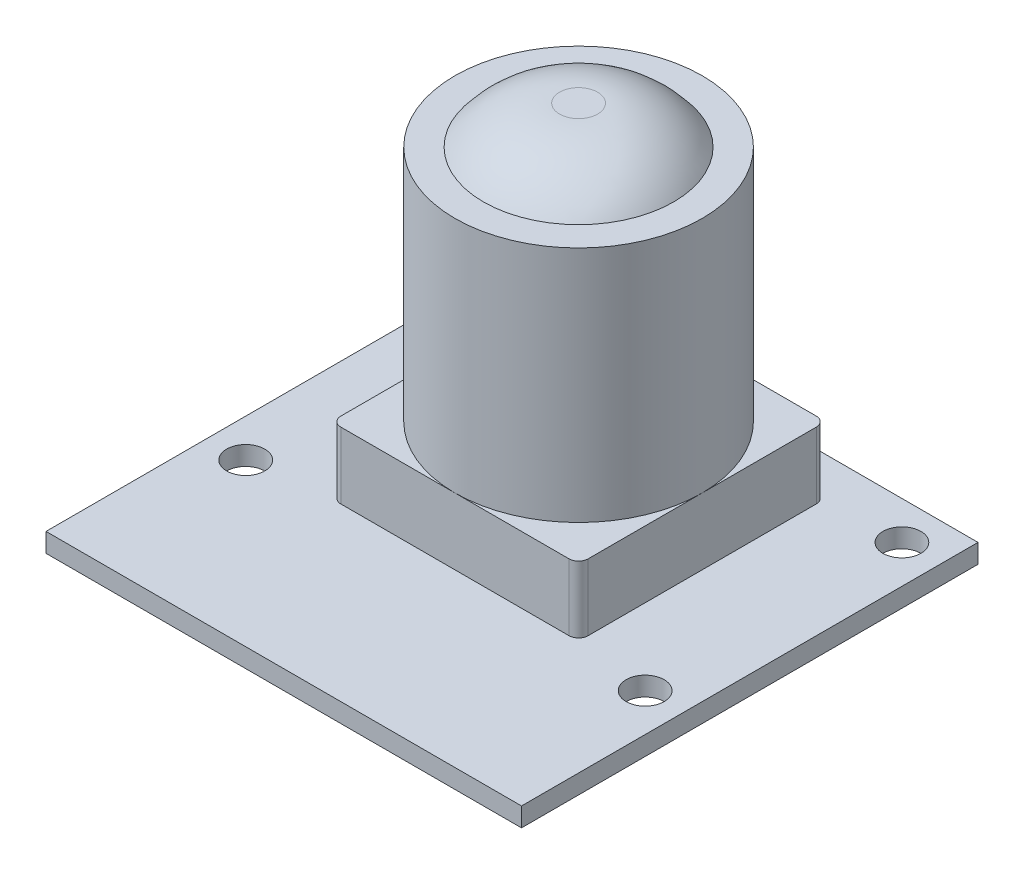
ISO-10303-21;
HEADER;
FILE_DESCRIPTION(('STEP AP214'),'2;1');
FILE_NAME('part.step','',(''),(''),'','','');
FILE_SCHEMA(('AUTOMOTIVE_DESIGN { 1 0 10303 214 1 1 1 1 }'));
ENDSEC;
DATA;
#1=APPLICATION_CONTEXT('core data for automotive mechanical design processes');
#2=APPLICATION_PROTOCOL_DEFINITION('international standard','automotive_design',2000,#1);
#3=PRODUCT_CONTEXT('',#1,'mechanical');
#4=PRODUCT('Part','Part','',(#3));
#5=PRODUCT_RELATED_PRODUCT_CATEGORY('part','',(#4));
#6=PRODUCT_DEFINITION_FORMATION('','',#4);
#7=PRODUCT_DEFINITION_CONTEXT('part definition',#1,'design');
#8=PRODUCT_DEFINITION('design','',#6,#7);
#9=PRODUCT_DEFINITION_SHAPE('','',#8);
#10=(LENGTH_UNIT() NAMED_UNIT(*) SI_UNIT(.MILLI.,.METRE.));
#11=(NAMED_UNIT(*) PLANE_ANGLE_UNIT() SI_UNIT($,.RADIAN.));
#12=(NAMED_UNIT(*) SI_UNIT($,.STERADIAN.) SOLID_ANGLE_UNIT());
#13=UNCERTAINTY_MEASURE_WITH_UNIT(LENGTH_MEASURE(1.E-05),#10,'distance_accuracy_value','');
#14=(GEOMETRIC_REPRESENTATION_CONTEXT(3) GLOBAL_UNCERTAINTY_ASSIGNED_CONTEXT((#13)) GLOBAL_UNIT_ASSIGNED_CONTEXT((#10,
#11,#12)) REPRESENTATION_CONTEXT('',''));
#15=CARTESIAN_POINT('',(0.,0.,0.));
#16=DIRECTION('',(0.,0.,1.));
#17=DIRECTION('',(1.,0.,0.));
#18=AXIS2_PLACEMENT_3D('',#15,#16,#17);
#19=CARTESIAN_POINT('',(0.,1.,0.));
#20=DIRECTION('',(0.,1.,0.));
#21=DIRECTION('',(0.,0.,1.));
#22=AXIS2_PLACEMENT_3D('',#19,#20,#21);
#23=PLANE('',#22);
#24=CARTESIAN_POINT('',(-23.,1.,-8.49999999999999));
#25=DIRECTION('',(0.,1.,0.));
#26=DIRECTION('',(0.,0.,1.));
#27=AXIS2_PLACEMENT_3D('',#24,#25,#26);
#28=CIRCLE('',#27,1.);
#29=CARTESIAN_POINT('',(-23.,1.,-7.49999999999999));
#30=VERTEX_POINT('',#29);
#31=EDGE_CURVE('E188',#30,#30,#28,.T.);
#32=ORIENTED_EDGE('',*,*,#31,.F.);
#33=EDGE_LOOP('',(#32));
#34=FACE_BOUND('',#33,.T.);
#35=CARTESIAN_POINT('',(-2.,1.,-22.));
#36=DIRECTION('',(0.,1.,0.));
#37=DIRECTION('',(0.,0.,1.));
#38=AXIS2_PLACEMENT_3D('',#35,#36,#37);
#39=CIRCLE('',#38,1.);
#40=CARTESIAN_POINT('',(-2.,1.,-21.));
#41=VERTEX_POINT('',#40);
#42=EDGE_CURVE('E204',#41,#41,#39,.T.);
#43=ORIENTED_EDGE('',*,*,#42,.F.);
#44=EDGE_LOOP('',(#43));
#45=FACE_BOUND('',#44,.T.);
#46=DIRECTION('',(0.,0.,-1.));
#47=VECTOR('',#46,1.);
#48=CARTESIAN_POINT('',(0.,1.,0.));
#49=LINE('',#48,#47);
#50=CARTESIAN_POINT('',(0.,1.,0.));
#51=VERTEX_POINT('',#50);
#52=CARTESIAN_POINT('',(0.,1.,-24.));
#53=VERTEX_POINT('',#52);
#54=EDGE_CURVE('E212',#51,#53,#49,.T.);
#55=ORIENTED_EDGE('',*,*,#54,.T.);
#56=DIRECTION('',(-1.,0.,0.));
#57=VECTOR('',#56,1.);
#58=CARTESIAN_POINT('',(0.,1.,-24.));
#59=LINE('',#58,#57);
#60=CARTESIAN_POINT('',(-25.,1.,-24.));
#61=VERTEX_POINT('',#60);
#62=EDGE_CURVE('E216',#53,#61,#59,.T.);
#63=ORIENTED_EDGE('',*,*,#62,.T.);
#64=DIRECTION('',(0.,0.,1.));
#65=VECTOR('',#64,1.);
#66=CARTESIAN_POINT('',(-25.,1.,0.));
#67=LINE('',#66,#65);
#68=CARTESIAN_POINT('',(-25.,1.,0.));
#69=VERTEX_POINT('',#68);
#70=EDGE_CURVE('E220',#61,#69,#67,.T.);
#71=ORIENTED_EDGE('',*,*,#70,.T.);
#72=DIRECTION('',(1.,0.,0.));
#73=VECTOR('',#72,1.);
#74=CARTESIAN_POINT('',(0.,1.,0.));
#75=LINE('',#74,#73);
#76=EDGE_CURVE('E223',#69,#51,#75,.T.);
#77=ORIENTED_EDGE('',*,*,#76,.T.);
#78=EDGE_LOOP('',(#55,#63,#71,#77));
#79=FACE_BOUND('',#78,.T.);
#80=CARTESIAN_POINT('',(-23.,1.,-22.));
#81=DIRECTION('',(0.,1.,0.));
#82=DIRECTION('',(0.,0.,1.));
#83=AXIS2_PLACEMENT_3D('',#80,#81,#82);
#84=CIRCLE('',#83,1.);
#85=CARTESIAN_POINT('',(-23.,1.,-21.));
#86=VERTEX_POINT('',#85);
#87=EDGE_CURVE('E196',#86,#86,#84,.T.);
#88=ORIENTED_EDGE('',*,*,#87,.F.);
#89=EDGE_LOOP('',(#88));
#90=FACE_BOUND('',#89,.T.);
#91=CARTESIAN_POINT('',(-2.,1.,-8.49999999999999));
#92=DIRECTION('',(0.,1.,0.));
#93=DIRECTION('',(0.,0.,1.));
#94=AXIS2_PLACEMENT_3D('',#91,#92,#93);
#95=CIRCLE('',#94,1.);
#96=CARTESIAN_POINT('',(-2.,1.,-7.49999999999999));
#97=VERTEX_POINT('',#96);
#98=EDGE_CURVE('E180',#97,#97,#95,.T.);
#99=ORIENTED_EDGE('',*,*,#98,.F.);
#100=EDGE_LOOP('',(#99));
#101=FACE_BOUND('',#100,.T.);
#102=DIRECTION('',(1.,0.,0.));
#103=VECTOR('',#102,1.);
#104=CARTESIAN_POINT('',(-18.5,1.,-9.));
#105=LINE('',#104,#103);
#106=CARTESIAN_POINT('',(-18.5,1.,-9.));
#107=VERTEX_POINT('',#106);
#108=CARTESIAN_POINT('',(-6.5,1.,-9.));
#109=VERTEX_POINT('',#108);
#110=EDGE_CURVE('E57',#107,#109,#105,.T.);
#111=ORIENTED_EDGE('',*,*,#110,.F.);
#112=CARTESIAN_POINT('',(-18.5,1.,-9.5));
#113=DIRECTION('',(0.,1.,0.));
#114=DIRECTION('',(0.,0.,1.));
#115=AXIS2_PLACEMENT_3D('',#112,#113,#114);
#116=CIRCLE('',#115,0.5);
#117=CARTESIAN_POINT('',(-19.,1.,-9.50000000000001));
#118=VERTEX_POINT('',#117);
#119=EDGE_CURVE('E61',#118,#107,#116,.T.);
#120=ORIENTED_EDGE('',*,*,#119,.F.);
#121=DIRECTION('',(0.,0.,1.));
#122=VECTOR('',#121,1.);
#123=CARTESIAN_POINT('',(-19.,1.,-21.5));
#124=LINE('',#123,#122);
#125=CARTESIAN_POINT('',(-19.,1.,-21.5));
#126=VERTEX_POINT('',#125);
#127=EDGE_CURVE('E167',#126,#118,#124,.T.);
#128=ORIENTED_EDGE('',*,*,#127,.F.);
#129=CARTESIAN_POINT('',(-18.5,1.,-21.5));
#130=DIRECTION('',(0.,-1.,0.));
#131=DIRECTION('',(0.,0.,-1.));
#132=AXIS2_PLACEMENT_3D('',#129,#130,#131);
#133=CIRCLE('',#132,0.5);
#134=CARTESIAN_POINT('',(-18.5,1.,-22.));
#135=VERTEX_POINT('',#134);
#136=EDGE_CURVE('E153',#126,#135,#133,.T.);
#137=ORIENTED_EDGE('',*,*,#136,.T.);
#138=DIRECTION('',(1.,0.,0.));
#139=VECTOR('',#138,1.);
#140=CARTESIAN_POINT('',(-18.5,1.,-22.));
#141=LINE('',#140,#139);
#142=CARTESIAN_POINT('',(-6.50000000000001,1.,-22.));
#143=VERTEX_POINT('',#142);
#144=EDGE_CURVE('E328',#135,#143,#141,.T.);
#145=ORIENTED_EDGE('',*,*,#144,.T.);
#146=CARTESIAN_POINT('',(-6.5,1.,-21.5));
#147=DIRECTION('',(0.,-1.,0.));
#148=DIRECTION('',(0.,0.,-1.));
#149=AXIS2_PLACEMENT_3D('',#146,#147,#148);
#150=CIRCLE('',#149,0.5);
#151=CARTESIAN_POINT('',(-6.,1.,-21.5));
#152=VERTEX_POINT('',#151);
#153=EDGE_CURVE('E324',#143,#152,#150,.T.);
#154=ORIENTED_EDGE('',*,*,#153,.T.);
#155=DIRECTION('',(0.,0.,1.));
#156=VECTOR('',#155,1.);
#157=CARTESIAN_POINT('',(-6.,1.,-21.5));
#158=LINE('',#157,#156);
#159=CARTESIAN_POINT('',(-6.,1.,-9.5));
#160=VERTEX_POINT('',#159);
#161=EDGE_CURVE('E321',#152,#160,#158,.T.);
#162=ORIENTED_EDGE('',*,*,#161,.T.);
#163=CARTESIAN_POINT('',(-6.5,1.,-9.5));
#164=DIRECTION('',(0.,1.,0.));
#165=DIRECTION('',(0.,0.,1.));
#166=AXIS2_PLACEMENT_3D('',#163,#164,#165);
#167=CIRCLE('',#166,0.5);
#168=EDGE_CURVE('E317',#109,#160,#167,.T.);
#169=ORIENTED_EDGE('',*,*,#168,.F.);
#170=EDGE_LOOP('',(#111,#120,#128,#137,#145,#154,#162,#169));
#171=FACE_BOUND('',#170,.T.);
#172=ADVANCED_FACE('F41',(#34,#45,#79,#90,#101,#171),#23,.T.);
#173=CARTESIAN_POINT('',(0.,0.,0.));
#174=DIRECTION('',(0.,1.,0.));
#175=DIRECTION('',(0.,0.,1.));
#176=AXIS2_PLACEMENT_3D('',#173,#174,#175);
#177=PLANE('',#176);
#178=CARTESIAN_POINT('',(-3.5,0.,-15.5));
#179=DIRECTION('',(0.,1.,0.));
#180=DIRECTION('',(0.,0.,1.));
#181=AXIS2_PLACEMENT_3D('',#178,#179,#180);
#182=CIRCLE('',#181,1.5);
#183=CARTESIAN_POINT('',(-3.5,0.,-14.));
#184=VERTEX_POINT('',#183);
#185=EDGE_CURVE('E276',#184,#184,#182,.T.);
#186=ORIENTED_EDGE('',*,*,#185,.T.);
#187=EDGE_LOOP('',(#186));
#188=FACE_BOUND('',#187,.T.);
#189=CARTESIAN_POINT('',(-21.5,0.,-15.5));
#190=DIRECTION('',(0.,1.,0.));
#191=DIRECTION('',(0.,0.,1.));
#192=AXIS2_PLACEMENT_3D('',#189,#190,#191);
#193=CIRCLE('',#192,1.5);
#194=CARTESIAN_POINT('',(-21.5,0.,-14.));
#195=VERTEX_POINT('',#194);
#196=EDGE_CURVE('E261',#195,#195,#193,.F.);
#197=ORIENTED_EDGE('',*,*,#196,.F.);
#198=EDGE_LOOP('',(#197));
#199=FACE_BOUND('',#198,.T.);
#200=DIRECTION('',(0.,0.,-1.));
#201=VECTOR('',#200,1.);
#202=CARTESIAN_POINT('',(0.,0.,0.));
#203=LINE('',#202,#201);
#204=CARTESIAN_POINT('',(0.,0.,0.));
#205=VERTEX_POINT('',#204);
#206=CARTESIAN_POINT('',(0.,0.,-24.));
#207=VERTEX_POINT('',#206);
#208=EDGE_CURVE('E208',#205,#207,#203,.T.);
#209=ORIENTED_EDGE('',*,*,#208,.F.);
#210=DIRECTION('',(1.,0.,0.));
#211=VECTOR('',#210,1.);
#212=CARTESIAN_POINT('',(0.,0.,0.));
#213=LINE('',#212,#211);
#214=CARTESIAN_POINT('',(-25.,0.,0.));
#215=VERTEX_POINT('',#214);
#216=EDGE_CURVE('E217',#215,#205,#213,.T.);
#217=ORIENTED_EDGE('',*,*,#216,.F.);
#218=DIRECTION('',(0.,0.,1.));
#219=VECTOR('',#218,1.);
#220=CARTESIAN_POINT('',(-25.,0.,0.));
#221=LINE('',#220,#219);
#222=CARTESIAN_POINT('',(-25.,0.,-24.));
#223=VERTEX_POINT('',#222);
#224=EDGE_CURVE('E233',#223,#215,#221,.T.);
#225=ORIENTED_EDGE('',*,*,#224,.F.);
#226=DIRECTION('',(-1.,0.,0.));
#227=VECTOR('',#226,1.);
#228=CARTESIAN_POINT('',(0.,0.,-24.));
#229=LINE('',#228,#227);
#230=EDGE_CURVE('E230',#207,#223,#229,.T.);
#231=ORIENTED_EDGE('',*,*,#230,.F.);
#232=EDGE_LOOP('',(#209,#217,#225,#231));
#233=FACE_BOUND('',#232,.T.);
#234=CARTESIAN_POINT('',(-2.,0.,-22.));
#235=DIRECTION('',(0.,1.,0.));
#236=DIRECTION('',(0.,0.,1.));
#237=AXIS2_PLACEMENT_3D('',#234,#235,#236);
#238=CIRCLE('',#237,1.);
#239=CARTESIAN_POINT('',(-2.,0.,-21.));
#240=VERTEX_POINT('',#239);
#241=EDGE_CURVE('E200',#240,#240,#238,.T.);
#242=ORIENTED_EDGE('',*,*,#241,.T.);
#243=EDGE_LOOP('',(#242));
#244=FACE_BOUND('',#243,.T.);
#245=CARTESIAN_POINT('',(-23.,0.,-22.));
#246=DIRECTION('',(0.,1.,0.));
#247=DIRECTION('',(0.,0.,1.));
#248=AXIS2_PLACEMENT_3D('',#245,#246,#247);
#249=CIRCLE('',#248,1.);
#250=CARTESIAN_POINT('',(-23.,0.,-21.));
#251=VERTEX_POINT('',#250);
#252=EDGE_CURVE('E192',#251,#251,#249,.T.);
#253=ORIENTED_EDGE('',*,*,#252,.T.);
#254=EDGE_LOOP('',(#253));
#255=FACE_BOUND('',#254,.T.);
#256=CARTESIAN_POINT('',(-23.,0.,-8.49999999999999));
#257=DIRECTION('',(0.,1.,0.));
#258=DIRECTION('',(0.,0.,1.));
#259=AXIS2_PLACEMENT_3D('',#256,#257,#258);
#260=CIRCLE('',#259,1.);
#261=CARTESIAN_POINT('',(-23.,0.,-7.49999999999999));
#262=VERTEX_POINT('',#261);
#263=EDGE_CURVE('E184',#262,#262,#260,.T.);
#264=ORIENTED_EDGE('',*,*,#263,.T.);
#265=EDGE_LOOP('',(#264));
#266=FACE_BOUND('',#265,.T.);
#267=CARTESIAN_POINT('',(-2.,0.,-8.49999999999999));
#268=DIRECTION('',(0.,1.,0.));
#269=DIRECTION('',(0.,0.,1.));
#270=AXIS2_PLACEMENT_3D('',#267,#268,#269);
#271=CIRCLE('',#270,1.);
#272=CARTESIAN_POINT('',(-2.,0.,-7.49999999999999));
#273=VERTEX_POINT('',#272);
#274=EDGE_CURVE('E174',#273,#273,#271,.T.);
#275=ORIENTED_EDGE('',*,*,#274,.T.);
#276=EDGE_LOOP('',(#275));
#277=FACE_BOUND('',#276,.T.);
#278=ADVANCED_FACE('F409',(#188,#199,#233,#244,#255,#266,#277),#177,.F.);
#279=CARTESIAN_POINT('',(0.,1.,0.));
#280=DIRECTION('',(-1.,0.,0.));
#281=DIRECTION('',(0.,0.,1.));
#282=AXIS2_PLACEMENT_3D('',#279,#280,#281);
#283=PLANE('',#282);
#284=ORIENTED_EDGE('',*,*,#208,.T.);
#285=DIRECTION('',(0.,-1.,0.));
#286=VECTOR('',#285,1.);
#287=CARTESIAN_POINT('',(0.,1.,-24.));
#288=LINE('',#287,#286);
#289=EDGE_CURVE('E249',#53,#207,#288,.T.);
#290=ORIENTED_EDGE('',*,*,#289,.F.);
#291=ORIENTED_EDGE('',*,*,#54,.F.);
#292=DIRECTION('',(0.,-1.,0.));
#293=VECTOR('',#292,1.);
#294=CARTESIAN_POINT('',(0.,1.,0.));
#295=LINE('',#294,#293);
#296=EDGE_CURVE('E226',#51,#205,#295,.T.);
#297=ORIENTED_EDGE('',*,*,#296,.T.);
#298=EDGE_LOOP('',(#284,#290,#291,#297));
#299=FACE_BOUND('',#298,.T.);
#300=ADVANCED_FACE('F415',(#299),#283,.F.);
#301=CARTESIAN_POINT('',(0.,1.,-24.));
#302=DIRECTION('',(0.,0.,1.));
#303=DIRECTION('',(1.,0.,0.));
#304=AXIS2_PLACEMENT_3D('',#301,#302,#303);
#305=PLANE('',#304);
#306=ORIENTED_EDGE('',*,*,#230,.T.);
#307=DIRECTION('',(0.,-1.,0.));
#308=VECTOR('',#307,1.);
#309=CARTESIAN_POINT('',(-25.,1.,-24.));
#310=LINE('',#309,#308);
#311=EDGE_CURVE('E245',#61,#223,#310,.T.);
#312=ORIENTED_EDGE('',*,*,#311,.F.);
#313=ORIENTED_EDGE('',*,*,#62,.F.);
#314=ORIENTED_EDGE('',*,*,#289,.T.);
#315=EDGE_LOOP('',(#306,#312,#313,#314));
#316=FACE_BOUND('',#315,.T.);
#317=ADVANCED_FACE('F430',(#316),#305,.F.);
#318=CARTESIAN_POINT('',(-25.,1.,0.));
#319=DIRECTION('',(1.,0.,0.));
#320=DIRECTION('',(0.,0.,-1.));
#321=AXIS2_PLACEMENT_3D('',#318,#319,#320);
#322=PLANE('',#321);
#323=ORIENTED_EDGE('',*,*,#224,.T.);
#324=DIRECTION('',(0.,-1.,0.));
#325=VECTOR('',#324,1.);
#326=CARTESIAN_POINT('',(-25.,1.,0.));
#327=LINE('',#326,#325);
#328=EDGE_CURVE('E241',#69,#215,#327,.T.);
#329=ORIENTED_EDGE('',*,*,#328,.F.);
#330=ORIENTED_EDGE('',*,*,#70,.F.);
#331=ORIENTED_EDGE('',*,*,#311,.T.);
#332=EDGE_LOOP('',(#323,#329,#330,#331));
#333=FACE_BOUND('',#332,.T.);
#334=ADVANCED_FACE('F426',(#333),#322,.F.);
#335=CARTESIAN_POINT('',(0.,1.,0.));
#336=DIRECTION('',(0.,0.,-1.));
#337=DIRECTION('',(-1.,0.,0.));
#338=AXIS2_PLACEMENT_3D('',#335,#336,#337);
#339=PLANE('',#338);
#340=ORIENTED_EDGE('',*,*,#216,.T.);
#341=ORIENTED_EDGE('',*,*,#296,.F.);
#342=ORIENTED_EDGE('',*,*,#76,.F.);
#343=ORIENTED_EDGE('',*,*,#328,.T.);
#344=EDGE_LOOP('',(#340,#341,#342,#343));
#345=FACE_BOUND('',#344,.T.);
#346=ADVANCED_FACE('F423',(#345),#339,.F.);
#347=CARTESIAN_POINT('',(-2.,1.,-22.));
#348=DIRECTION('',(0.,-1.,0.));
#349=DIRECTION('',(0.,0.,-1.));
#350=AXIS2_PLACEMENT_3D('',#347,#348,#349);
#351=CYLINDRICAL_SURFACE('',#350,1.);
#352=ORIENTED_EDGE('',*,*,#42,.T.);
#353=EDGE_LOOP('',(#352));
#354=FACE_BOUND('',#353,.T.);
#355=ORIENTED_EDGE('',*,*,#241,.F.);
#356=EDGE_LOOP('',(#355));
#357=FACE_BOUND('',#356,.T.);
#358=ADVANCED_FACE('F420',(#354,#357),#351,.F.);
#359=CARTESIAN_POINT('',(-23.,1.,-22.));
#360=DIRECTION('',(0.,-1.,0.));
#361=DIRECTION('',(0.,0.,-1.));
#362=AXIS2_PLACEMENT_3D('',#359,#360,#361);
#363=CYLINDRICAL_SURFACE('',#362,1.);
#364=ORIENTED_EDGE('',*,*,#87,.T.);
#365=EDGE_LOOP('',(#364));
#366=FACE_BOUND('',#365,.T.);
#367=ORIENTED_EDGE('',*,*,#252,.F.);
#368=EDGE_LOOP('',(#367));
#369=FACE_BOUND('',#368,.T.);
#370=ADVANCED_FACE('F472',(#366,#369),#363,.F.);
#371=CARTESIAN_POINT('',(-23.,1.,-8.49999999999999));
#372=DIRECTION('',(0.,-1.,0.));
#373=DIRECTION('',(0.,0.,-1.));
#374=AXIS2_PLACEMENT_3D('',#371,#372,#373);
#375=CYLINDRICAL_SURFACE('',#374,1.);
#376=ORIENTED_EDGE('',*,*,#31,.T.);
#377=EDGE_LOOP('',(#376));
#378=FACE_BOUND('',#377,.T.);
#379=ORIENTED_EDGE('',*,*,#263,.F.);
#380=EDGE_LOOP('',(#379));
#381=FACE_BOUND('',#380,.T.);
#382=ADVANCED_FACE('F469',(#378,#381),#375,.F.);
#383=CARTESIAN_POINT('',(-2.,1.,-8.49999999999999));
#384=DIRECTION('',(0.,-1.,0.));
#385=DIRECTION('',(0.,0.,-1.));
#386=AXIS2_PLACEMENT_3D('',#383,#384,#385);
#387=CYLINDRICAL_SURFACE('',#386,1.);
#388=ORIENTED_EDGE('',*,*,#98,.T.);
#389=EDGE_LOOP('',(#388));
#390=FACE_BOUND('',#389,.T.);
#391=ORIENTED_EDGE('',*,*,#274,.F.);
#392=EDGE_LOOP('',(#391));
#393=FACE_BOUND('',#392,.T.);
#394=ADVANCED_FACE('F466',(#390,#393),#387,.F.);
#395=CARTESIAN_POINT('',(-19.,4.5,-21.5));
#396=DIRECTION('',(1.,0.,0.));
#397=DIRECTION('',(0.,0.,-1.));
#398=AXIS2_PLACEMENT_3D('',#395,#396,#397);
#399=PLANE('',#398);
#400=DIRECTION('',(0.,0.,1.));
#401=VECTOR('',#400,1.);
#402=CARTESIAN_POINT('',(-19.,4.5,-21.5));
#403=LINE('',#402,#401);
#404=CARTESIAN_POINT('',(-19.,4.5,-15.5));
#405=VERTEX_POINT('',#404);
#406=CARTESIAN_POINT('',(-19.,4.5,-9.50000000000001));
#407=VERTEX_POINT('',#406);
#408=EDGE_CURVE('E140',#405,#407,#403,.T.);
#409=ORIENTED_EDGE('',*,*,#408,.F.);
#410=CARTESIAN_POINT('',(-19.,4.5,-21.5));
#411=VERTEX_POINT('',#410);
#412=EDGE_CURVE('E152',#411,#405,#403,.T.);
#413=ORIENTED_EDGE('',*,*,#412,.F.);
#414=DIRECTION('',(0.,-1.,0.));
#415=VECTOR('',#414,1.);
#416=CARTESIAN_POINT('',(-19.,4.5,-21.5));
#417=LINE('',#416,#415);
#418=EDGE_CURVE('E311',#411,#126,#417,.T.);
#419=ORIENTED_EDGE('',*,*,#418,.T.);
#420=ORIENTED_EDGE('',*,*,#127,.T.);
#421=DIRECTION('',(0.,-1.,0.));
#422=VECTOR('',#421,1.);
#423=CARTESIAN_POINT('',(-19.,4.5,-9.50000000000001));
#424=LINE('',#423,#422);
#425=EDGE_CURVE('E158',#407,#118,#424,.T.);
#426=ORIENTED_EDGE('',*,*,#425,.F.);
#427=EDGE_LOOP('',(#409,#413,#419,#420,#426));
#428=FACE_BOUND('',#427,.T.);
#429=ADVANCED_FACE('F165',(#428),#399,.F.);
#430=CARTESIAN_POINT('',(-18.5,4.5,-9.));
#431=DIRECTION('',(0.,0.,-1.));
#432=DIRECTION('',(-1.,0.,0.));
#433=AXIS2_PLACEMENT_3D('',#430,#431,#432);
#434=PLANE('',#433);
#435=DIRECTION('',(1.,0.,0.));
#436=VECTOR('',#435,1.);
#437=CARTESIAN_POINT('',(-18.5,4.5,-9.));
#438=LINE('',#437,#436);
#439=CARTESIAN_POINT('',(-12.5,4.5,-9.));
#440=VERTEX_POINT('',#439);
#441=CARTESIAN_POINT('',(-6.5,4.5,-9.));
#442=VERTEX_POINT('',#441);
#443=EDGE_CURVE('E163',#440,#442,#438,.T.);
#444=ORIENTED_EDGE('',*,*,#443,.F.);
#445=CARTESIAN_POINT('',(-18.5,4.5,-9.));
#446=VERTEX_POINT('',#445);
#447=EDGE_CURVE('E287',#446,#440,#438,.T.);
#448=ORIENTED_EDGE('',*,*,#447,.F.);
#449=DIRECTION('',(0.,-1.,0.));
#450=VECTOR('',#449,1.);
#451=CARTESIAN_POINT('',(-18.5,4.5,-9.));
#452=LINE('',#451,#450);
#453=EDGE_CURVE('E160',#446,#107,#452,.T.);
#454=ORIENTED_EDGE('',*,*,#453,.T.);
#455=ORIENTED_EDGE('',*,*,#110,.T.);
#456=DIRECTION('',(0.,-1.,0.));
#457=VECTOR('',#456,1.);
#458=CARTESIAN_POINT('',(-6.5,4.5,-9.));
#459=LINE('',#458,#457);
#460=EDGE_CURVE('E176',#442,#109,#459,.T.);
#461=ORIENTED_EDGE('',*,*,#460,.F.);
#462=EDGE_LOOP('',(#444,#448,#454,#455,#461));
#463=FACE_BOUND('',#462,.T.);
#464=ADVANCED_FACE('F360',(#463),#434,.F.);
#465=CARTESIAN_POINT('',(-6.,4.5,-21.5));
#466=DIRECTION('',(1.,0.,0.));
#467=DIRECTION('',(0.,0.,-1.));
#468=AXIS2_PLACEMENT_3D('',#465,#466,#467);
#469=PLANE('',#468);
#470=ORIENTED_EDGE('',*,*,#161,.F.);
#471=DIRECTION('',(0.,-1.,0.));
#472=VECTOR('',#471,1.);
#473=CARTESIAN_POINT('',(-6.,4.5,-21.5));
#474=LINE('',#473,#472);
#475=CARTESIAN_POINT('',(-6.,4.5,-21.5));
#476=VERTEX_POINT('',#475);
#477=EDGE_CURVE('E344',#476,#152,#474,.T.);
#478=ORIENTED_EDGE('',*,*,#477,.F.);
#479=DIRECTION('',(0.,0.,1.));
#480=VECTOR('',#479,1.);
#481=CARTESIAN_POINT('',(-6.,4.5,-21.5));
#482=LINE('',#481,#480);
#483=CARTESIAN_POINT('',(-6.,4.5,-15.5));
#484=VERTEX_POINT('',#483);
#485=EDGE_CURVE('E295',#476,#484,#482,.T.);
#486=ORIENTED_EDGE('',*,*,#485,.T.);
#487=CARTESIAN_POINT('',(-6.,4.5,-9.5));
#488=VERTEX_POINT('',#487);
#489=EDGE_CURVE('E294',#484,#488,#482,.T.);
#490=ORIENTED_EDGE('',*,*,#489,.T.);
#491=DIRECTION('',(0.,-1.,0.));
#492=VECTOR('',#491,1.);
#493=CARTESIAN_POINT('',(-6.,4.5,-9.5));
#494=LINE('',#493,#492);
#495=EDGE_CURVE('E348',#488,#160,#494,.T.);
#496=ORIENTED_EDGE('',*,*,#495,.T.);
#497=EDGE_LOOP('',(#470,#478,#486,#490,#496));
#498=FACE_BOUND('',#497,.T.);
#499=ADVANCED_FACE('F396',(#498),#469,.T.);
#500=CARTESIAN_POINT('',(-18.5,4.5,-22.));
#501=DIRECTION('',(0.,0.,-1.));
#502=DIRECTION('',(-1.,0.,0.));
#503=AXIS2_PLACEMENT_3D('',#500,#501,#502);
#504=PLANE('',#503);
#505=ORIENTED_EDGE('',*,*,#144,.F.);
#506=DIRECTION('',(0.,-1.,0.));
#507=VECTOR('',#506,1.);
#508=CARTESIAN_POINT('',(-18.5,4.5,-22.));
#509=LINE('',#508,#507);
#510=CARTESIAN_POINT('',(-18.5,4.5,-22.));
#511=VERTEX_POINT('',#510);
#512=EDGE_CURVE('E336',#511,#135,#509,.T.);
#513=ORIENTED_EDGE('',*,*,#512,.F.);
#514=DIRECTION('',(1.,0.,0.));
#515=VECTOR('',#514,1.);
#516=CARTESIAN_POINT('',(-18.5,4.5,-22.));
#517=LINE('',#516,#515);
#518=CARTESIAN_POINT('',(-12.5,4.5,-22.));
#519=VERTEX_POINT('',#518);
#520=EDGE_CURVE('E304',#511,#519,#517,.T.);
#521=ORIENTED_EDGE('',*,*,#520,.T.);
#522=CARTESIAN_POINT('',(-6.50000000000001,4.5,-22.));
#523=VERTEX_POINT('',#522);
#524=EDGE_CURVE('E303',#519,#523,#517,.T.);
#525=ORIENTED_EDGE('',*,*,#524,.T.);
#526=DIRECTION('',(0.,-1.,0.));
#527=VECTOR('',#526,1.);
#528=CARTESIAN_POINT('',(-6.50000000000001,4.5,-22.));
#529=LINE('',#528,#527);
#530=EDGE_CURVE('E340',#523,#143,#529,.T.);
#531=ORIENTED_EDGE('',*,*,#530,.T.);
#532=EDGE_LOOP('',(#505,#513,#521,#525,#531));
#533=FACE_BOUND('',#532,.T.);
#534=ADVANCED_FACE('F388',(#533),#504,.T.);
#535=CARTESIAN_POINT('',(-18.5,4.5,-9.5));
#536=DIRECTION('',(0.,1.,0.));
#537=DIRECTION('',(0.,0.,1.));
#538=AXIS2_PLACEMENT_3D('',#535,#536,#537);
#539=PLANE('',#538);
#540=CARTESIAN_POINT('',(-12.5,4.5,-15.5));
#541=DIRECTION('',(0.,1.,0.));
#542=DIRECTION('',(0.,0.,1.));
#543=AXIS2_PLACEMENT_3D('',#540,#541,#542);
#544=CIRCLE('',#543,6.5);
#545=EDGE_CURVE('E256',#440,#484,#544,.T.);
#546=ORIENTED_EDGE('',*,*,#545,.F.);
#547=ORIENTED_EDGE('',*,*,#443,.T.);
#548=CARTESIAN_POINT('',(-6.5,4.5,-9.5));
#549=DIRECTION('',(0.,1.,0.));
#550=DIRECTION('',(0.,0.,1.));
#551=AXIS2_PLACEMENT_3D('',#548,#549,#550);
#552=CIRCLE('',#551,0.5);
#553=EDGE_CURVE('E290',#442,#488,#552,.T.);
#554=ORIENTED_EDGE('',*,*,#553,.T.);
#555=ORIENTED_EDGE('',*,*,#489,.F.);
#556=EDGE_LOOP('',(#546,#547,#554,#555));
#557=FACE_BOUND('',#556,.T.);
#558=ADVANCED_FACE('F366',(#557),#539,.T.);
#559=EDGE_CURVE('E370',#484,#519,#544,.T.);
#560=ORIENTED_EDGE('',*,*,#559,.F.);
#561=ORIENTED_EDGE('',*,*,#485,.F.);
#562=CARTESIAN_POINT('',(-6.5,4.5,-21.5));
#563=DIRECTION('',(0.,-1.,0.));
#564=DIRECTION('',(0.,0.,-1.));
#565=AXIS2_PLACEMENT_3D('',#562,#563,#564);
#566=CIRCLE('',#565,0.5);
#567=EDGE_CURVE('E299',#523,#476,#566,.T.);
#568=ORIENTED_EDGE('',*,*,#567,.F.);
#569=ORIENTED_EDGE('',*,*,#524,.F.);
#570=EDGE_LOOP('',(#560,#561,#568,#569));
#571=FACE_BOUND('',#570,.T.);
#572=ADVANCED_FACE('F383',(#571),#539,.T.);
#573=EDGE_CURVE('E255',#519,#405,#544,.T.);
#574=ORIENTED_EDGE('',*,*,#573,.F.);
#575=ORIENTED_EDGE('',*,*,#520,.F.);
#576=CARTESIAN_POINT('',(-18.5,4.5,-21.5));
#577=DIRECTION('',(0.,-1.,0.));
#578=DIRECTION('',(0.,0.,-1.));
#579=AXIS2_PLACEMENT_3D('',#576,#577,#578);
#580=CIRCLE('',#579,0.5);
#581=EDGE_CURVE('E308',#411,#511,#580,.T.);
#582=ORIENTED_EDGE('',*,*,#581,.F.);
#583=ORIENTED_EDGE('',*,*,#412,.T.);
#584=EDGE_LOOP('',(#574,#575,#582,#583));
#585=FACE_BOUND('',#584,.T.);
#586=ADVANCED_FACE('F379',(#585),#539,.T.);
#587=CARTESIAN_POINT('',(-18.5,4.5,-9.5));
#588=DIRECTION('',(0.,-1.,0.));
#589=DIRECTION('',(0.,0.,-1.));
#590=AXIS2_PLACEMENT_3D('',#587,#588,#589);
#591=CYLINDRICAL_SURFACE('',#590,0.5);
#592=ORIENTED_EDGE('',*,*,#119,.T.);
#593=ORIENTED_EDGE('',*,*,#453,.F.);
#594=CARTESIAN_POINT('',(-18.5,4.5,-9.5));
#595=DIRECTION('',(0.,1.,0.));
#596=DIRECTION('',(0.,0.,1.));
#597=AXIS2_PLACEMENT_3D('',#594,#595,#596);
#598=CIRCLE('',#597,0.5);
#599=EDGE_CURVE('E143',#407,#446,#598,.T.);
#600=ORIENTED_EDGE('',*,*,#599,.F.);
#601=ORIENTED_EDGE('',*,*,#425,.T.);
#602=EDGE_LOOP('',(#592,#593,#600,#601));
#603=FACE_BOUND('',#602,.T.);
#604=ADVANCED_FACE('F157',(#603),#591,.T.);
#605=CARTESIAN_POINT('',(-6.5,4.5,-9.5));
#606=DIRECTION('',(0.,-1.,0.));
#607=DIRECTION('',(0.,0.,-1.));
#608=AXIS2_PLACEMENT_3D('',#605,#606,#607);
#609=CYLINDRICAL_SURFACE('',#608,0.5);
#610=ORIENTED_EDGE('',*,*,#168,.T.);
#611=ORIENTED_EDGE('',*,*,#495,.F.);
#612=ORIENTED_EDGE('',*,*,#553,.F.);
#613=ORIENTED_EDGE('',*,*,#460,.T.);
#614=EDGE_LOOP('',(#610,#611,#612,#613));
#615=FACE_BOUND('',#614,.T.);
#616=ADVANCED_FACE('F356',(#615),#609,.T.);
#617=CARTESIAN_POINT('',(-6.5,4.5,-21.5));
#618=DIRECTION('',(0.,-1.,0.));
#619=DIRECTION('',(0.,0.,-1.));
#620=AXIS2_PLACEMENT_3D('',#617,#618,#619);
#621=CYLINDRICAL_SURFACE('',#620,0.5);
#622=ORIENTED_EDGE('',*,*,#153,.F.);
#623=ORIENTED_EDGE('',*,*,#530,.F.);
#624=ORIENTED_EDGE('',*,*,#567,.T.);
#625=ORIENTED_EDGE('',*,*,#477,.T.);
#626=EDGE_LOOP('',(#622,#623,#624,#625));
#627=FACE_BOUND('',#626,.T.);
#628=ADVANCED_FACE('F394',(#627),#621,.T.);
#629=CARTESIAN_POINT('',(-18.5,4.5,-21.5));
#630=DIRECTION('',(0.,-1.,0.));
#631=DIRECTION('',(0.,0.,-1.));
#632=AXIS2_PLACEMENT_3D('',#629,#630,#631);
#633=CYLINDRICAL_SURFACE('',#632,0.5);
#634=ORIENTED_EDGE('',*,*,#136,.F.);
#635=ORIENTED_EDGE('',*,*,#418,.F.);
#636=ORIENTED_EDGE('',*,*,#581,.T.);
#637=ORIENTED_EDGE('',*,*,#512,.T.);
#638=EDGE_LOOP('',(#634,#635,#636,#637));
#639=FACE_BOUND('',#638,.T.);
#640=ADVANCED_FACE('F391',(#639),#633,.T.);
#641=EDGE_CURVE('E146',#405,#440,#544,.T.);
#642=ORIENTED_EDGE('',*,*,#641,.F.);
#643=ORIENTED_EDGE('',*,*,#408,.T.);
#644=ORIENTED_EDGE('',*,*,#599,.T.);
#645=ORIENTED_EDGE('',*,*,#447,.T.);
#646=EDGE_LOOP('',(#642,#643,#644,#645));
#647=FACE_BOUND('',#646,.T.);
#648=ADVANCED_FACE('F142',(#647),#539,.T.);
#649=CARTESIAN_POINT('',(-12.5,17.,-15.5));
#650=DIRECTION('',(0.,1.,0.));
#651=DIRECTION('',(0.,0.,1.));
#652=AXIS2_PLACEMENT_3D('',#649,#650,#651);
#653=PLANE('',#652);
#654=CARTESIAN_POINT('',(-12.5,17.,-15.5));
#655=DIRECTION('',(0.,1.,0.));
#656=DIRECTION('',(0.,0.,1.));
#657=AXIS2_PLACEMENT_3D('',#654,#655,#656);
#658=CIRCLE('',#657,5.);
#659=CARTESIAN_POINT('',(-12.5,17.,-10.5));
#660=VERTEX_POINT('',#659);
#661=EDGE_CURVE('E262',#660,#660,#658,.T.);
#662=ORIENTED_EDGE('',*,*,#661,.F.);
#663=EDGE_LOOP('',(#662));
#664=FACE_BOUND('',#663,.T.);
#665=CARTESIAN_POINT('',(-12.5,17.,-15.5));
#666=DIRECTION('',(0.,1.,0.));
#667=DIRECTION('',(0.,0.,1.));
#668=AXIS2_PLACEMENT_3D('',#665,#666,#667);
#669=CIRCLE('',#668,6.5);
#670=CARTESIAN_POINT('',(-12.5,17.,-9.));
#671=VERTEX_POINT('',#670);
#672=EDGE_CURVE('E169',#671,#671,#669,.T.);
#673=ORIENTED_EDGE('',*,*,#672,.T.);
#674=EDGE_LOOP('',(#673));
#675=FACE_BOUND('',#674,.T.);
#676=ADVANCED_FACE('F455',(#664,#675),#653,.T.);
#677=CARTESIAN_POINT('',(-12.5,17.,-15.5));
#678=DIRECTION('',(0.,-1.,0.));
#679=DIRECTION('',(0.,0.,-1.));
#680=AXIS2_PLACEMENT_3D('',#677,#678,#679);
#681=CYLINDRICAL_SURFACE('',#680,6.5);
#682=ORIENTED_EDGE('',*,*,#641,.T.);
#683=ORIENTED_EDGE('',*,*,#545,.T.);
#684=ORIENTED_EDGE('',*,*,#559,.T.);
#685=ORIENTED_EDGE('',*,*,#573,.T.);
#686=EDGE_LOOP('',(#682,#683,#684,#685));
#687=FACE_BOUND('',#686,.T.);
#688=ORIENTED_EDGE('',*,*,#672,.F.);
#689=EDGE_LOOP('',(#688));
#690=FACE_BOUND('',#689,.T.);
#691=ADVANCED_FACE('F372',(#687,#690),#681,.T.);
#692=CARTESIAN_POINT('',(-12.5,19.,-15.5));
#693=DIRECTION('',(0.,1.,0.));
#694=DIRECTION('',(0.,0.,1.));
#695=AXIS2_PLACEMENT_3D('',#692,#693,#694);
#696=PLANE('',#695);
#697=CARTESIAN_POINT('',(-12.5,19.,-15.5));
#698=DIRECTION('',(0.,1.,0.));
#699=DIRECTION('',(0.,0.,1.));
#700=AXIS2_PLACEMENT_3D('',#697,#698,#699);
#701=CIRCLE('',#700,1.);
#702=CARTESIAN_POINT('',(-12.5,19.,-14.5));
#703=VERTEX_POINT('',#702);
#704=EDGE_CURVE('E257',#703,#703,#701,.T.);
#705=ORIENTED_EDGE('',*,*,#704,.T.);
#706=EDGE_LOOP('',(#705));
#707=FACE_BOUND('',#706,.T.);
#708=ADVANCED_FACE('F441',(#707),#696,.T.);
#709=CARTESIAN_POINT('',(-12.5,14.,-15.5));
#710=DIRECTION('',(0.,-1.,0.));
#711=DIRECTION('',(0.,0.,-1.));
#712=AXIS2_PLACEMENT_3D('',#709,#710,#711);
#713=DEGENERATE_TOROIDAL_SURFACE('',#712,1.,5.,.T.);
#714=ORIENTED_EDGE('',*,*,#661,.T.);
#715=EDGE_LOOP('',(#714));
#716=FACE_BOUND('',#715,.T.);
#717=ORIENTED_EDGE('',*,*,#704,.F.);
#718=EDGE_LOOP('',(#717));
#719=FACE_BOUND('',#718,.T.);
#720=ADVANCED_FACE('F438',(#716,#719),#713,.T.);
#721=CARTESIAN_POINT('',(-21.5,-1.,-15.5));
#722=DIRECTION('',(0.,-1.,0.));
#723=DIRECTION('',(0.,0.,-1.));
#724=AXIS2_PLACEMENT_3D('',#721,#722,#723);
#725=PLANE('',#724);
#726=CARTESIAN_POINT('',(-21.5,-1.,-15.5));
#727=DIRECTION('',(0.,-1.,0.));
#728=DIRECTION('',(0.,0.,-1.));
#729=AXIS2_PLACEMENT_3D('',#726,#727,#728);
#730=CIRCLE('',#729,0.5);
#731=CARTESIAN_POINT('',(-21.5,-1.,-16.));
#732=VERTEX_POINT('',#731);
#733=EDGE_CURVE('E11',#732,#732,#730,.T.);
#734=ORIENTED_EDGE('',*,*,#733,.T.);
#735=EDGE_LOOP('',(#734));
#736=FACE_BOUND('',#735,.T.);
#737=ADVANCED_FACE('F440',(#736),#725,.T.);
#738=CARTESIAN_POINT('',(-3.5,-1.,-15.5));
#739=DIRECTION('',(0.,1.,0.));
#740=DIRECTION('',(0.,0.,1.));
#741=AXIS2_PLACEMENT_3D('',#738,#739,#740);
#742=PLANE('',#741);
#743=CARTESIAN_POINT('',(-3.5,-1.,-15.5));
#744=DIRECTION('',(0.,1.,0.));
#745=DIRECTION('',(0.,0.,1.));
#746=AXIS2_PLACEMENT_3D('',#743,#744,#745);
#747=CIRCLE('',#746,0.5);
#748=CARTESIAN_POINT('',(-3.5,-1.,-15.));
#749=VERTEX_POINT('',#748);
#750=EDGE_CURVE('E50',#749,#749,#747,.F.);
#751=ORIENTED_EDGE('',*,*,#750,.T.);
#752=EDGE_LOOP('',(#751));
#753=FACE_BOUND('',#752,.T.);
#754=ADVANCED_FACE('F269',(#753),#742,.F.);
#755=CARTESIAN_POINT('',(-3.5,0.,-15.5));
#756=DIRECTION('',(0.,1.,0.));
#757=DIRECTION('',(0.,0.,1.));
#758=AXIS2_PLACEMENT_3D('',#755,#756,#757);
#759=DEGENERATE_TOROIDAL_SURFACE('',#758,0.5,1.,.T.);
#760=ORIENTED_EDGE('',*,*,#750,.F.);
#761=EDGE_LOOP('',(#760));
#762=FACE_BOUND('',#761,.T.);
#763=ORIENTED_EDGE('',*,*,#185,.F.);
#764=EDGE_LOOP('',(#763));
#765=FACE_BOUND('',#764,.T.);
#766=ADVANCED_FACE('F271',(#762,#765),#759,.T.);
#767=CARTESIAN_POINT('',(-21.5,0.,-15.5));
#768=DIRECTION('',(0.,-1.,0.));
#769=DIRECTION('',(0.,0.,-1.));
#770=AXIS2_PLACEMENT_3D('',#767,#768,#769);
#771=DEGENERATE_TOROIDAL_SURFACE('',#770,0.5,1.,.T.);
#772=ORIENTED_EDGE('',*,*,#196,.T.);
#773=EDGE_LOOP('',(#772));
#774=FACE_BOUND('',#773,.T.);
#775=ORIENTED_EDGE('',*,*,#733,.F.);
#776=EDGE_LOOP('',(#775));
#777=FACE_BOUND('',#776,.T.);
#778=ADVANCED_FACE('F43',(#774,#777),#771,.T.);
#779=CLOSED_SHELL('',(#172,#278,#300,#317,#334,#346,#358,#370,#382,#394,#429,#464,#499,#534,
#558,#572,#586,#604,#616,#628,#640,#648,#676,#691,#708,#720,#737,#754,#766,#778));
#780=MANIFOLD_SOLID_BREP('B2',#779);
#781=ADVANCED_BREP_SHAPE_REPRESENTATION('',(#18,#780),#14);
#782=SHAPE_DEFINITION_REPRESENTATION(#9,#781);
ENDSEC;
END-ISO-10303-21;
